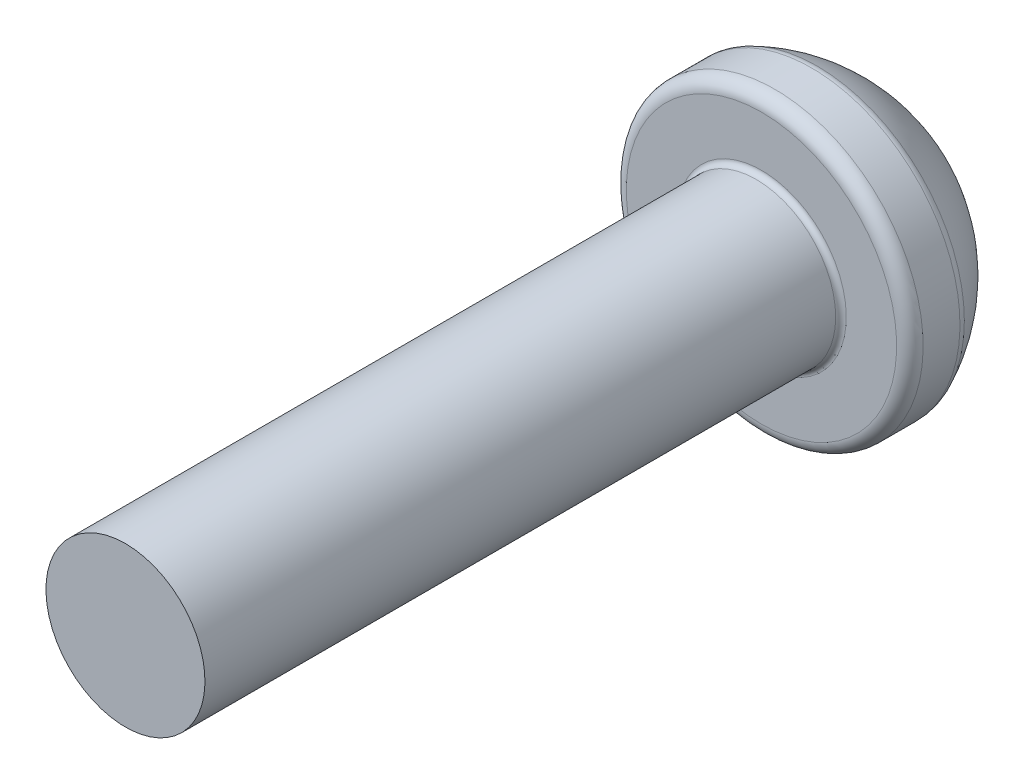
ISO-10303-21;
HEADER;
FILE_DESCRIPTION(('STEP AP214'),'2;1');
FILE_NAME('part.step','',(''),(''),'','','');
FILE_SCHEMA(('AUTOMOTIVE_DESIGN { 1 0 10303 214 1 1 1 1 }'));
ENDSEC;
DATA;
#1=APPLICATION_CONTEXT('core data for automotive mechanical design processes');
#2=APPLICATION_PROTOCOL_DEFINITION('international standard','automotive_design',2000,#1);
#3=PRODUCT_CONTEXT('',#1,'mechanical');
#4=PRODUCT('Part','Part','',(#3));
#5=PRODUCT_RELATED_PRODUCT_CATEGORY('part','',(#4));
#6=PRODUCT_DEFINITION_FORMATION('','',#4);
#7=PRODUCT_DEFINITION_CONTEXT('part definition',#1,'design');
#8=PRODUCT_DEFINITION('design','',#6,#7);
#9=PRODUCT_DEFINITION_SHAPE('','',#8);
#10=(LENGTH_UNIT() NAMED_UNIT(*) SI_UNIT(.MILLI.,.METRE.));
#11=(NAMED_UNIT(*) PLANE_ANGLE_UNIT() SI_UNIT($,.RADIAN.));
#12=(NAMED_UNIT(*) SI_UNIT($,.STERADIAN.) SOLID_ANGLE_UNIT());
#13=UNCERTAINTY_MEASURE_WITH_UNIT(LENGTH_MEASURE(1.E-05),#10,'distance_accuracy_value','');
#14=(GEOMETRIC_REPRESENTATION_CONTEXT(3) GLOBAL_UNCERTAINTY_ASSIGNED_CONTEXT((#13)) GLOBAL_UNIT_ASSIGNED_CONTEXT((#10,
#11,#12)) REPRESENTATION_CONTEXT('',''));
#15=CARTESIAN_POINT('',(0.,0.,0.));
#16=DIRECTION('',(0.,0.,1.));
#17=DIRECTION('',(1.,0.,0.));
#18=AXIS2_PLACEMENT_3D('',#15,#16,#17);
#19=CARTESIAN_POINT('',(0.,0.,12.));
#20=DIRECTION('',(0.,0.,1.));
#21=DIRECTION('',(0.,-1.,0.));
#22=AXIS2_PLACEMENT_3D('',#19,#20,#21);
#23=PLANE('',#22);
#24=CARTESIAN_POINT('',(0.,0.,12.));
#25=DIRECTION('',(0.,0.,-1.));
#26=DIRECTION('',(0.,1.,0.));
#27=AXIS2_PLACEMENT_3D('',#24,#25,#26);
#28=CIRCLE('',#27,1.5);
#29=CARTESIAN_POINT('',(0.,1.5,12.));
#30=VERTEX_POINT('',#29);
#31=EDGE_CURVE('E267',#30,#30,#28,.T.);
#32=ORIENTED_EDGE('',*,*,#31,.F.);
#33=EDGE_LOOP('',(#32));
#34=FACE_BOUND('',#33,.T.);
#35=ADVANCED_FACE('F36',(#34),#23,.T.);
#36=CARTESIAN_POINT('',(0.,0.,-2.4));
#37=DIRECTION('',(0.,0.,-1.));
#38=DIRECTION('',(0.,1.,0.));
#39=AXIS2_PLACEMENT_3D('',#36,#37,#38);
#40=CYLINDRICAL_SURFACE('',#39,1.5);
#41=CARTESIAN_POINT('',(0.,0.,0.0999999999999959));
#42=DIRECTION('',(0.,0.,1.));
#43=DIRECTION('',(0.,-1.,0.));
#44=AXIS2_PLACEMENT_3D('',#41,#42,#43);
#45=CIRCLE('',#44,1.5);
#46=CARTESIAN_POINT('',(0.,-1.5,0.0999999999999958));
#47=VERTEX_POINT('',#46);
#48=EDGE_CURVE('E273',#47,#47,#45,.T.);
#49=ORIENTED_EDGE('',*,*,#48,.T.);
#50=EDGE_LOOP('',(#49));
#51=FACE_BOUND('',#50,.T.);
#52=ORIENTED_EDGE('',*,*,#31,.T.);
#53=EDGE_LOOP('',(#52));
#54=FACE_BOUND('',#53,.T.);
#55=ADVANCED_FACE('F311',(#51,#54),#40,.T.);
#56=CARTESIAN_POINT('',(0.,1.5,0.));
#57=DIRECTION('',(0.,0.,1.));
#58=DIRECTION('',(0.,-1.,0.));
#59=AXIS2_PLACEMENT_3D('',#56,#57,#58);
#60=PLANE('',#59);
#61=CARTESIAN_POINT('',(0.,0.,0.));
#62=DIRECTION('',(0.,0.,1.));
#63=DIRECTION('',(0.,-1.,0.));
#64=AXIS2_PLACEMENT_3D('',#61,#62,#63);
#65=CIRCLE('',#64,2.55);
#66=CARTESIAN_POINT('',(0.,-2.55,0.));
#67=VERTEX_POINT('',#66);
#68=EDGE_CURVE('E11',#67,#67,#65,.T.);
#69=ORIENTED_EDGE('',*,*,#68,.T.);
#70=EDGE_LOOP('',(#69));
#71=FACE_BOUND('',#70,.T.);
#72=CARTESIAN_POINT('',(0.,0.,0.));
#73=DIRECTION('',(0.,0.,1.));
#74=DIRECTION('',(0.,-1.,0.));
#75=AXIS2_PLACEMENT_3D('',#72,#73,#74);
#76=CIRCLE('',#75,1.6);
#77=CARTESIAN_POINT('',(0.,-1.6,0.));
#78=VERTEX_POINT('',#77);
#79=EDGE_CURVE('E270',#78,#78,#76,.F.);
#80=ORIENTED_EDGE('',*,*,#79,.T.);
#81=EDGE_LOOP('',(#80));
#82=FACE_BOUND('',#81,.T.);
#83=ADVANCED_FACE('F317',(#71,#82),#60,.T.);
#84=CARTESIAN_POINT('',(0.,0.,-2.4));
#85=DIRECTION('',(0.,0.,-1.));
#86=DIRECTION('',(0.,1.,0.));
#87=AXIS2_PLACEMENT_3D('',#84,#85,#86);
#88=CYLINDRICAL_SURFACE('',#87,2.8);
#89=CARTESIAN_POINT('',(0.,0.,-0.945424841825034));
#90=DIRECTION('',(0.,0.,1.));
#91=DIRECTION('',(0.,-1.,0.));
#92=AXIS2_PLACEMENT_3D('',#89,#90,#91);
#93=CIRCLE('',#92,2.8);
#94=CARTESIAN_POINT('',(0.,-2.79999999999999,-0.945424841825034));
#95=VERTEX_POINT('',#94);
#96=EDGE_CURVE('E44',#95,#95,#93,.T.);
#97=ORIENTED_EDGE('',*,*,#96,.T.);
#98=EDGE_LOOP('',(#97));
#99=FACE_BOUND('',#98,.T.);
#100=CARTESIAN_POINT('',(0.,0.,-0.25));
#101=DIRECTION('',(0.,0.,1.));
#102=DIRECTION('',(0.,-1.,0.));
#103=AXIS2_PLACEMENT_3D('',#100,#101,#102);
#104=CIRCLE('',#103,2.8);
#105=CARTESIAN_POINT('',(0.,-2.79999999999999,-0.25));
#106=VERTEX_POINT('',#105);
#107=EDGE_CURVE('E279',#106,#106,#104,.F.);
#108=ORIENTED_EDGE('',*,*,#107,.T.);
#109=EDGE_LOOP('',(#108));
#110=FACE_BOUND('',#109,.T.);
#111=ADVANCED_FACE('F284',(#99,#110),#88,.T.);
#112=CARTESIAN_POINT('',(0.,0.,0.252999999999989));
#113=DIRECTION('',(0.,0.,-1.));
#114=DIRECTION('',(0.,1.,0.));
#115=AXIS2_PLACEMENT_3D('',#112,#113,#114);
#116=SPHERICAL_SURFACE('',#115,3.06757379699332);
#117=CARTESIAN_POINT('',(0.,0.,-1.05175966463463));
#118=DIRECTION('',(0.,0.,1.));
#119=DIRECTION('',(0.,-1.,0.));
#120=AXIS2_PLACEMENT_3D('',#117,#118,#119);
#121=CIRCLE('',#120,2.77625849256558);
#122=CARTESIAN_POINT('',(0.,2.7762584925656,-1.05175966463463));
#123=VERTEX_POINT('',#122);
#124=EDGE_CURVE('E276',#123,#123,#121,.F.);
#125=CARTESIAN_POINT('',(0.,0.,-2.4));
#126=DIRECTION('',(0.,0.,-1.));
#127=DIRECTION('',(0.,1.,0.));
#128=AXIS2_PLACEMENT_3D('',#125,#126,#127);
#129=CIRCLE('',#128,1.54);
#130=CARTESIAN_POINT('',(0.,1.54000000000003,-2.4));
#131=VERTEX_POINT('',#130);
#132=EDGE_CURVE('E263',#131,#131,#129,.T.);
#133=CARTESIAN_POINT('',(0.,2.7762584925656,-1.05175966463463));
#134=CARTESIAN_POINT('',(0.,2.7680287356093,-1.06927093928298));
#135=CARTESIAN_POINT('',(0.,2.75963325856512,-1.08670432952202));
#136=CARTESIAN_POINT('',(0.,2.74251396302796,-1.12140914487731));
#137=CARTESIAN_POINT('',(0.,2.73379014453498,-1.13868056999356));
#138=CARTESIAN_POINT('',(0.,2.71601726482719,-1.17305525879907));
#139=CARTESIAN_POINT('',(0.,2.70696820361239,-1.19015852248834));
#140=CARTESIAN_POINT('',(0.,2.68854808514227,-1.22419076788491));
#141=CARTESIAN_POINT('',(0.,2.67917702788696,-1.24111974959221));
#142=CARTESIAN_POINT('',(0.,2.66011627086749,-1.27479736870806));
#143=CARTESIAN_POINT('',(0.,2.65042657110332,-1.2915460061166));
#144=CARTESIAN_POINT('',(0.,2.63073199894966,-1.32485694000622));
#145=CARTESIAN_POINT('',(0.,2.62072712656017,-1.34141923648728));
#146=CARTESIAN_POINT('',(0.,2.60040579128123,-1.37435155831383));
#147=CARTESIAN_POINT('',(0.,2.59008932839179,-1.3907215836593));
#148=CARTESIAN_POINT('',(0.,2.56914850596595,-1.4232635019295));
#149=CARTESIAN_POINT('',(0.,2.55852414642956,-1.43943539485421));
#150=CARTESIAN_POINT('',(0.,2.53697133476198,-1.47157525791774));
#151=CARTESIAN_POINT('',(0.,2.5260428826308,-1.48754322805656));
#152=CARTESIAN_POINT('',(0.,2.50388579871809,-1.51926952820363));
#153=CARTESIAN_POINT('',(0.,2.49265716693656,-1.53502785821189));
#154=CARTESIAN_POINT('',(0.,2.46990374414406,-1.56632923581349));
#155=CARTESIAN_POINT('',(0.,2.45837895313309,-1.58187228340683));
#156=CARTESIAN_POINT('',(0.,2.43503733834353,-1.6127375309767));
#157=CARTESIAN_POINT('',(0.,2.42322051456494,-1.62805973095323));
#158=CARTESIAN_POINT('',(0.,2.39929906526433,-1.65847779716217));
#159=CARTESIAN_POINT('',(0.,2.38719443974231,-1.67357366339458));
#160=CARTESIAN_POINT('',(0.,2.36270172102676,-1.70353365702699));
#161=CARTESIAN_POINT('',(0.,2.35031362783323,-1.71839778442699));
#162=CARTESIAN_POINT('',(0.,2.32525840934239,-1.74788897828058));
#163=CARTESIAN_POINT('',(0.,2.3125912840451,-1.76251604473417));
#164=CARTESIAN_POINT('',(0.,2.28698253682219,-1.79152787946082));
#165=CARTESIAN_POINT('',(0.,2.27404091489658,-1.80591264773389));
#166=CARTESIAN_POINT('',(0.,2.24788780817625,-1.83443473562044));
#167=CARTESIAN_POINT('',(0.,2.23467632338154,-1.84857205523394));
#168=CARTESIAN_POINT('',(0.,2.20798822130685,-1.87659418392154));
#169=CARTESIAN_POINT('',(0.,2.19451160402688,-1.89047899299564));
#170=CARTESIAN_POINT('',(0.,2.16729806229645,-1.91799112913625));
#171=CARTESIAN_POINT('',(0.,2.15356113784599,-1.93161845620276));
#172=CARTESIAN_POINT('',(0.,2.12583190029257,-1.95861074905163));
#173=CARTESIAN_POINT('',(0.,2.11183958718961,-1.971975714834));
#174=CARTESIAN_POINT('',(0.,2.0836045822913,-1.99843849977674));
#175=CARTESIAN_POINT('',(0.,2.06936189049595,-2.0115363189371));
#176=CARTESIAN_POINT('',(0.,2.04063122782131,-2.03746012095011));
#177=CARTESIAN_POINT('',(0.,2.02614325694202,-2.05028610380276));
#178=CARTESIAN_POINT('',(0.,1.99692722353024,-2.07566164084561));
#179=CARTESIAN_POINT('',(0.,1.98219916099774,-2.08821119503583));
#180=CARTESIAN_POINT('',(0.,1.95250821767576,-2.11302938137545));
#181=CARTESIAN_POINT('',(0.,1.93754533688628,-2.12529801352486));
#182=CARTESIAN_POINT('',(0.,1.90739011452165,-2.14954996298589));
#183=CARTESIAN_POINT('',(0.,1.89219777294651,-2.16153328029752));
#184=CARTESIAN_POINT('',(0.,1.86158906864724,-2.18521030945437));
#185=CARTESIAN_POINT('',(0.,1.84617270592312,-2.19690402129959));
#186=CARTESIAN_POINT('',(0.,1.81512147914842,-2.21999765254702));
#187=CARTESIAN_POINT('',(0.,1.79948661509784,-2.23139757194921));
#188=CARTESIAN_POINT('',(0.,1.76800398382117,-2.25389953668146));
#189=CARTESIAN_POINT('',(0.,1.75215621659508,-2.2650015820115));
#190=CARTESIAN_POINT('',(0.,1.72025345299829,-2.28690382304649));
#191=CARTESIAN_POINT('',(0.,1.70419845662759,-2.29770401875144));
#192=CARTESIAN_POINT('',(0.,1.67188698427812,-2.31899869521752));
#193=CARTESIAN_POINT('',(0.,1.65563050829935,-2.32949317597865));
#194=CARTESIAN_POINT('',(0.,1.62292189353217,-2.35017265865099));
#195=CARTESIAN_POINT('',(0.,1.60646975474376,-2.36035766056221));
#196=CARTESIAN_POINT('',(0.,1.57337571941822,-2.38041456247663));
#197=CARTESIAN_POINT('',(0.,1.55673382288108,-2.39028646247984));
#198=CARTESIAN_POINT('',(0.,1.54000000000003,-2.4));
#199=B_SPLINE_CURVE_WITH_KNOTS('',3,(#133,#134,#135,#136,#137,#138,#139,#140,#141,#142,#143,
#144,#145,#146,#147,#148,#149,#150,#151,#152,#153,#154,#155,#156,#157,#158,#159,#160,#161,#162,
#163,#164,#165,#166,#167,#168,#169,#170,#171,#172,#173,#174,#175,#176,#177,#178,#179,#180,#181,
#182,#183,#184,#185,#186,#187,#188,#189,#190,#191,#192,#193,#194,#195,#196,#197,#198),
.UNSPECIFIED.,.F.,.F.,(4,2,2,2,2,2,2,2,2,2,2,2,2,2,2,2,2,2,2,2,2,2,2,2,2,2,2,2,2,2,2,2,4),(0.,
0.058045344934751,0.116090689869502,0.174136034804254,0.232181379739005,0.290226724673756,
0.348272069608506,0.406317414543258,0.464362759478009,0.52240810441276,0.580453449347511,
0.638498794282262,0.696544139217013,0.754589484151765,0.812634829086516,0.870680174021267,
0.928725518956018,0.986770863890769,1.04481620882552,1.10286155376027,1.16090689869502,
1.21895224362977,1.27699758856452,1.33504293349928,1.39308827843403,1.45113362336878,
1.50917896830353,1.56722431323828,1.62526965817303,1.68331500310778,1.74136034804253,
1.79940569297728,1.85745103791204),.UNSPECIFIED.);
#200=EDGE_CURVE('BSEAM293',#123,#131,#199,.T.);
#201=ORIENTED_EDGE('',*,*,#124,.T.);
#202=ORIENTED_EDGE('',*,*,#132,.F.);
#203=ORIENTED_EDGE('',*,*,#200,.T.);
#204=ORIENTED_EDGE('',*,*,#200,.F.);
#205=EDGE_LOOP('',(#201,#203,#202,#204));
#206=FACE_BOUND('',#205,.T.);
#207=ADVANCED_FACE('F293',(#206),#116,.T.);
#208=CARTESIAN_POINT('',(0.,0.,-2.4));
#209=DIRECTION('',(0.,0.,-1.));
#210=DIRECTION('',(0.,1.,0.));
#211=AXIS2_PLACEMENT_3D('',#208,#209,#210);
#212=PLANE('',#211);
#213=CARTESIAN_POINT('',(0.,0.,-2.4));
#214=DIRECTION('',(0.,0.,-1.));
#215=DIRECTION('',(0.,1.,0.));
#216=AXIS2_PLACEMENT_3D('',#213,#214,#215);
#217=CIRCLE('',#216,1.4);
#218=CARTESIAN_POINT('',(0.217707917147369,-1.38296900283821,-2.40000000000001));
#219=VERTEX_POINT('',#218);
#220=CARTESIAN_POINT('',(-0.217707917147369,-1.38296900283821,-2.4));
#221=VERTEX_POINT('',#220);
#222=EDGE_CURVE('E222',#219,#221,#217,.T.);
#223=ORIENTED_EDGE('',*,*,#222,.F.);
#224=CARTESIAN_POINT('',(0.807499999999989,-1.39863102711185,-2.4));
#225=DIRECTION('',(0.,0.,1.));
#226=DIRECTION('',(0.,1.,0.));
#227=AXIS2_PLACEMENT_3D('',#224,#225,#226);
#228=CIRCLE('',#227,0.59);
#229=CARTESIAN_POINT('',(1.08883233053066,-0.880025088273714,-2.4));
#230=VERTEX_POINT('',#229);
#231=EDGE_CURVE('E220',#230,#219,#228,.T.);
#232=ORIENTED_EDGE('',*,*,#231,.F.);
#233=CARTESIAN_POINT('',(0.,0.,-2.4));
#234=DIRECTION('',(0.,0.,-1.));
#235=DIRECTION('',(0.,1.,0.));
#236=AXIS2_PLACEMENT_3D('',#233,#234,#235);
#237=CIRCLE('',#236,1.4);
#238=CARTESIAN_POINT('',(1.30654024767801,-0.502943914564485,-2.40000000000001));
#239=VERTEX_POINT('',#238);
#240=EDGE_CURVE('E217',#239,#230,#237,.T.);
#241=ORIENTED_EDGE('',*,*,#240,.F.);
#242=CARTESIAN_POINT('',(1.61500000000001,0.,-2.4));
#243=DIRECTION('',(0.,0.,1.));
#244=DIRECTION('',(0.,1.,0.));
#245=AXIS2_PLACEMENT_3D('',#242,#243,#244);
#246=CIRCLE('',#245,0.59);
#247=CARTESIAN_POINT('',(1.306540247678,0.502943914564513,-2.40000000000001));
#248=VERTEX_POINT('',#247);
#249=EDGE_CURVE('E215',#248,#239,#246,.T.);
#250=ORIENTED_EDGE('',*,*,#249,.F.);
#251=CARTESIAN_POINT('',(0.,0.,-2.4));
#252=DIRECTION('',(0.,0.,-1.));
#253=DIRECTION('',(0.,1.,0.));
#254=AXIS2_PLACEMENT_3D('',#251,#252,#253);
#255=CIRCLE('',#254,1.4);
#256=CARTESIAN_POINT('',(1.08883233053066,0.880025088273756,-2.4));
#257=VERTEX_POINT('',#256);
#258=EDGE_CURVE('E212',#257,#248,#255,.T.);
#259=ORIENTED_EDGE('',*,*,#258,.F.);
#260=CARTESIAN_POINT('',(0.807500000000003,1.39863102711189,-2.40000000000001));
#261=DIRECTION('',(0.,0.,1.));
#262=DIRECTION('',(0.,1.,0.));
#263=AXIS2_PLACEMENT_3D('',#260,#261,#262);
#264=CIRCLE('',#263,0.59);
#265=CARTESIAN_POINT('',(0.217707917147369,1.38296900283824,-2.40000000000001));
#266=VERTEX_POINT('',#265);
#267=EDGE_CURVE('E210',#266,#257,#264,.T.);
#268=ORIENTED_EDGE('',*,*,#267,.F.);
#269=CARTESIAN_POINT('',(0.,0.,-2.4));
#270=DIRECTION('',(0.,0.,-1.));
#271=DIRECTION('',(0.,1.,0.));
#272=AXIS2_PLACEMENT_3D('',#269,#270,#271);
#273=CIRCLE('',#272,1.4);
#274=CARTESIAN_POINT('',(-0.217707917147369,1.38296900283824,-2.40000000000001));
#275=VERTEX_POINT('',#274);
#276=EDGE_CURVE('E207',#275,#266,#273,.T.);
#277=ORIENTED_EDGE('',*,*,#276,.F.);
#278=CARTESIAN_POINT('',(-0.807500000000017,1.39863102711187,-2.4));
#279=DIRECTION('',(0.,0.,1.));
#280=DIRECTION('',(0.,1.,0.));
#281=AXIS2_PLACEMENT_3D('',#278,#279,#280);
#282=CIRCLE('',#281,0.59);
#283=CARTESIAN_POINT('',(-1.08883233053068,0.880025088273728,-2.4));
#284=VERTEX_POINT('',#283);
#285=EDGE_CURVE('E205',#284,#275,#282,.T.);
#286=ORIENTED_EDGE('',*,*,#285,.F.);
#287=CARTESIAN_POINT('',(0.,0.,-2.4));
#288=DIRECTION('',(0.,0.,-1.));
#289=DIRECTION('',(0.,1.,0.));
#290=AXIS2_PLACEMENT_3D('',#287,#288,#289);
#291=CIRCLE('',#290,1.4);
#292=CARTESIAN_POINT('',(-1.30654024767801,0.502943914564513,-2.4));
#293=VERTEX_POINT('',#292);
#294=EDGE_CURVE('E203',#293,#284,#291,.T.);
#295=ORIENTED_EDGE('',*,*,#294,.F.);
#296=CARTESIAN_POINT('',(-1.61500000000001,0.,-2.4));
#297=DIRECTION('',(0.,0.,1.));
#298=DIRECTION('',(0.,1.,0.));
#299=AXIS2_PLACEMENT_3D('',#296,#297,#298);
#300=CIRCLE('',#299,0.59);
#301=CARTESIAN_POINT('',(-1.30654024767803,-0.502943914564485,-2.4));
#302=VERTEX_POINT('',#301);
#303=EDGE_CURVE('E163',#302,#293,#300,.T.);
#304=ORIENTED_EDGE('',*,*,#303,.F.);
#305=CARTESIAN_POINT('',(0.,0.,-2.4));
#306=DIRECTION('',(0.,0.,-1.));
#307=DIRECTION('',(0.,1.,0.));
#308=AXIS2_PLACEMENT_3D('',#305,#306,#307);
#309=CIRCLE('',#308,1.4);
#310=CARTESIAN_POINT('',(-1.08883233053063,-0.880025088273714,-2.4));
#311=VERTEX_POINT('',#310);
#312=EDGE_CURVE('E159',#311,#302,#309,.T.);
#313=ORIENTED_EDGE('',*,*,#312,.F.);
#314=CARTESIAN_POINT('',(-0.807500000000003,-1.39863102711185,-2.4));
#315=DIRECTION('',(0.,0.,1.));
#316=DIRECTION('',(0.,1.,0.));
#317=AXIS2_PLACEMENT_3D('',#314,#315,#316);
#318=CIRCLE('',#317,0.59);
#319=EDGE_CURVE('E225',#221,#311,#318,.T.);
#320=ORIENTED_EDGE('',*,*,#319,.F.);
#321=EDGE_LOOP('',(#223,#232,#241,#250,#259,#268,#277,#286,#295,#304,#313,#320));
#322=FACE_BOUND('',#321,.T.);
#323=ORIENTED_EDGE('',*,*,#132,.T.);
#324=EDGE_LOOP('',(#323));
#325=FACE_BOUND('',#324,.T.);
#326=ADVANCED_FACE('F296',(#322,#325),#212,.T.);
#327=CARTESIAN_POINT('',(0.,0.,0.0999999999999959));
#328=DIRECTION('',(0.,0.,1.));
#329=DIRECTION('',(0.,-1.,0.));
#330=AXIS2_PLACEMENT_3D('',#327,#328,#329);
#331=TOROIDAL_SURFACE('',#330,1.6,0.1);
#332=ORIENTED_EDGE('',*,*,#48,.F.);
#333=EDGE_LOOP('',(#332));
#334=FACE_BOUND('',#333,.T.);
#335=ORIENTED_EDGE('',*,*,#79,.F.);
#336=EDGE_LOOP('',(#335));
#337=FACE_BOUND('',#336,.T.);
#338=ADVANCED_FACE('F290',(#334,#337),#331,.F.);
#339=CARTESIAN_POINT('',(0.,0.,-0.945424841825034));
#340=DIRECTION('',(0.,0.,1.));
#341=DIRECTION('',(0.,-1.,0.));
#342=AXIS2_PLACEMENT_3D('',#339,#340,#341);
#343=TOROIDAL_SURFACE('',#342,2.55,0.25);
#344=ORIENTED_EDGE('',*,*,#96,.F.);
#345=EDGE_LOOP('',(#344));
#346=FACE_BOUND('',#345,.T.);
#347=ORIENTED_EDGE('',*,*,#124,.F.);
#348=EDGE_LOOP('',(#347));
#349=FACE_BOUND('',#348,.T.);
#350=ADVANCED_FACE('F287',(#346,#349),#343,.T.);
#351=CARTESIAN_POINT('',(0.,0.,-0.25));
#352=DIRECTION('',(0.,0.,1.));
#353=DIRECTION('',(0.,-1.,0.));
#354=AXIS2_PLACEMENT_3D('',#351,#352,#353);
#355=TOROIDAL_SURFACE('',#354,2.55,0.25);
#356=ORIENTED_EDGE('',*,*,#68,.F.);
#357=EDGE_LOOP('',(#356));
#358=FACE_BOUND('',#357,.T.);
#359=ORIENTED_EDGE('',*,*,#107,.F.);
#360=EDGE_LOOP('',(#359));
#361=FACE_BOUND('',#360,.T.);
#362=ADVANCED_FACE('F38',(#358,#361),#355,.T.);
#363=CARTESIAN_POINT('',(-1.61499999999999,0.,-1.4));
#364=DIRECTION('',(0.,0.,-1.));
#365=DIRECTION('',(0.,1.,0.));
#366=AXIS2_PLACEMENT_3D('',#363,#364,#365);
#367=CYLINDRICAL_SURFACE('',#366,0.59);
#368=CARTESIAN_POINT('',(-1.61499999999999,0.,-1.4));
#369=DIRECTION('',(0.,0.,1.));
#370=DIRECTION('',(0.,1.,0.));
#371=AXIS2_PLACEMENT_3D('',#368,#369,#370);
#372=CIRCLE('',#371,0.59);
#373=CARTESIAN_POINT('',(-1.306540247678,-0.502943914564485,-1.40000000000001));
#374=VERTEX_POINT('',#373);
#375=CARTESIAN_POINT('',(-1.025,0.,-1.40000000000001));
#376=VERTEX_POINT('',#375);
#377=EDGE_CURVE('E158',#374,#376,#372,.T.);
#378=ORIENTED_EDGE('',*,*,#377,.F.);
#379=DIRECTION('',(0.,0.,-1.));
#380=VECTOR('',#379,1.);
#381=CARTESIAN_POINT('',(-1.306540247678,-0.502943914564485,-1.40000000000001));
#382=LINE('',#381,#380);
#383=EDGE_CURVE('E229',#374,#302,#382,.T.);
#384=ORIENTED_EDGE('',*,*,#383,.T.);
#385=ORIENTED_EDGE('',*,*,#303,.T.);
#386=DIRECTION('',(0.,0.,-1.));
#387=VECTOR('',#386,1.);
#388=CARTESIAN_POINT('',(-1.30654024767804,0.502943914564513,-1.40000000000001));
#389=LINE('',#388,#387);
#390=CARTESIAN_POINT('',(-1.30654024767804,0.502943914564513,-1.40000000000001));
#391=VERTEX_POINT('',#390);
#392=EDGE_CURVE('E51',#391,#293,#389,.T.);
#393=ORIENTED_EDGE('',*,*,#392,.F.);
#394=EDGE_CURVE('E149',#376,#391,#372,.T.);
#395=ORIENTED_EDGE('',*,*,#394,.F.);
#396=EDGE_LOOP('',(#378,#384,#385,#393,#395));
#397=FACE_BOUND('',#396,.T.);
#398=ADVANCED_FACE('F161',(#397),#367,.T.);
#399=CARTESIAN_POINT('',(-0.807500000000003,-1.39863102711185,-1.40000000000001));
#400=DIRECTION('',(0.,0.,-1.));
#401=DIRECTION('',(0.,1.,0.));
#402=AXIS2_PLACEMENT_3D('',#399,#400,#401);
#403=CYLINDRICAL_SURFACE('',#402,0.59);
#404=CARTESIAN_POINT('',(-0.807500000000003,-1.39863102711185,-1.40000000000001));
#405=DIRECTION('',(0.,0.,1.));
#406=DIRECTION('',(0.,1.,0.));
#407=AXIS2_PLACEMENT_3D('',#404,#405,#406);
#408=CIRCLE('',#407,0.59);
#409=CARTESIAN_POINT('',(-0.217707917147369,-1.38296900283821,-1.40000000000001));
#410=VERTEX_POINT('',#409);
#411=CARTESIAN_POINT('',(-0.512499999999999,-0.887676038879043,-1.40000000000001));
#412=VERTEX_POINT('',#411);
#413=EDGE_CURVE('E197',#410,#412,#408,.T.);
#414=ORIENTED_EDGE('',*,*,#413,.F.);
#415=DIRECTION('',(0.,0.,-1.));
#416=VECTOR('',#415,1.);
#417=CARTESIAN_POINT('',(-0.217707917147369,-1.38296900283821,-1.40000000000001));
#418=LINE('',#417,#416);
#419=EDGE_CURVE('E235',#410,#221,#418,.T.);
#420=ORIENTED_EDGE('',*,*,#419,.T.);
#421=ORIENTED_EDGE('',*,*,#319,.T.);
#422=DIRECTION('',(0.,0.,-1.));
#423=VECTOR('',#422,1.);
#424=CARTESIAN_POINT('',(-1.08883233053066,-0.880025088273714,-1.40000000000001));
#425=LINE('',#424,#423);
#426=CARTESIAN_POINT('',(-1.08883233053066,-0.880025088273714,-1.40000000000001));
#427=VERTEX_POINT('',#426);
#428=EDGE_CURVE('E232',#427,#311,#425,.T.);
#429=ORIENTED_EDGE('',*,*,#428,.F.);
#430=EDGE_CURVE('E196',#412,#427,#408,.T.);
#431=ORIENTED_EDGE('',*,*,#430,.F.);
#432=EDGE_LOOP('',(#414,#420,#421,#429,#431));
#433=FACE_BOUND('',#432,.T.);
#434=ADVANCED_FACE('F368',(#433),#403,.T.);
#435=CARTESIAN_POINT('',(0.807500000000003,-1.39863102711187,-1.40000000000001));
#436=DIRECTION('',(0.,0.,-1.));
#437=DIRECTION('',(0.,1.,0.));
#438=AXIS2_PLACEMENT_3D('',#435,#436,#437);
#439=CYLINDRICAL_SURFACE('',#438,0.59);
#440=CARTESIAN_POINT('',(0.807500000000003,-1.39863102711187,-1.40000000000001));
#441=DIRECTION('',(0.,0.,1.));
#442=DIRECTION('',(0.,1.,0.));
#443=AXIS2_PLACEMENT_3D('',#440,#441,#442);
#444=CIRCLE('',#443,0.59);
#445=CARTESIAN_POINT('',(1.08883233053066,-0.880025088273714,-1.40000000000001));
#446=VERTEX_POINT('',#445);
#447=CARTESIAN_POINT('',(0.512500000000013,-0.887676038879043,-1.40000000000001));
#448=VERTEX_POINT('',#447);
#449=EDGE_CURVE('E190',#446,#448,#444,.T.);
#450=ORIENTED_EDGE('',*,*,#449,.F.);
#451=DIRECTION('',(0.,0.,-1.));
#452=VECTOR('',#451,1.);
#453=CARTESIAN_POINT('',(1.08883233053066,-0.880025088273714,-1.40000000000001));
#454=LINE('',#453,#452);
#455=EDGE_CURVE('E241',#446,#230,#454,.T.);
#456=ORIENTED_EDGE('',*,*,#455,.T.);
#457=ORIENTED_EDGE('',*,*,#231,.T.);
#458=DIRECTION('',(0.,0.,-1.));
#459=VECTOR('',#458,1.);
#460=CARTESIAN_POINT('',(0.217707917147383,-1.38296900283821,-1.40000000000001));
#461=LINE('',#460,#459);
#462=CARTESIAN_POINT('',(0.217707917147383,-1.38296900283821,-1.40000000000001));
#463=VERTEX_POINT('',#462);
#464=EDGE_CURVE('E238',#463,#219,#461,.T.);
#465=ORIENTED_EDGE('',*,*,#464,.F.);
#466=EDGE_CURVE('E189',#448,#463,#444,.T.);
#467=ORIENTED_EDGE('',*,*,#466,.F.);
#468=EDGE_LOOP('',(#450,#456,#457,#465,#467));
#469=FACE_BOUND('',#468,.T.);
#470=ADVANCED_FACE('F377',(#469),#439,.T.);
#471=CARTESIAN_POINT('',(1.61500000000001,0.,-1.40000000000001));
#472=DIRECTION('',(0.,0.,-1.));
#473=DIRECTION('',(0.,1.,0.));
#474=AXIS2_PLACEMENT_3D('',#471,#472,#473);
#475=CYLINDRICAL_SURFACE('',#474,0.59);
#476=CARTESIAN_POINT('',(1.61500000000001,0.,-1.40000000000001));
#477=DIRECTION('',(0.,0.,1.));
#478=DIRECTION('',(0.,1.,0.));
#479=AXIS2_PLACEMENT_3D('',#476,#477,#478);
#480=CIRCLE('',#479,0.59);
#481=CARTESIAN_POINT('',(1.30654024767803,0.502943914564513,-1.40000000000001));
#482=VERTEX_POINT('',#481);
#483=CARTESIAN_POINT('',(1.02499999999998,0.,-1.40000000000001));
#484=VERTEX_POINT('',#483);
#485=EDGE_CURVE('E183',#482,#484,#480,.T.);
#486=ORIENTED_EDGE('',*,*,#485,.F.);
#487=DIRECTION('',(0.,0.,-1.));
#488=VECTOR('',#487,1.);
#489=CARTESIAN_POINT('',(1.30654024767803,0.502943914564513,-1.40000000000001));
#490=LINE('',#489,#488);
#491=EDGE_CURVE('E247',#482,#248,#490,.T.);
#492=ORIENTED_EDGE('',*,*,#491,.T.);
#493=ORIENTED_EDGE('',*,*,#249,.T.);
#494=DIRECTION('',(0.,0.,-1.));
#495=VECTOR('',#494,1.);
#496=CARTESIAN_POINT('',(1.30654024767801,-0.502943914564485,-1.40000000000001));
#497=LINE('',#496,#495);
#498=CARTESIAN_POINT('',(1.30654024767801,-0.502943914564485,-1.40000000000001));
#499=VERTEX_POINT('',#498);
#500=EDGE_CURVE('E244',#499,#239,#497,.T.);
#501=ORIENTED_EDGE('',*,*,#500,.F.);
#502=EDGE_CURVE('E182',#484,#499,#480,.T.);
#503=ORIENTED_EDGE('',*,*,#502,.F.);
#504=EDGE_LOOP('',(#486,#492,#493,#501,#503));
#505=FACE_BOUND('',#504,.T.);
#506=ADVANCED_FACE('F387',(#505),#475,.T.);
#507=CARTESIAN_POINT('',(0.807499999999975,1.39863102711188,-1.40000000000001));
#508=DIRECTION('',(0.,0.,-1.));
#509=DIRECTION('',(0.,1.,0.));
#510=AXIS2_PLACEMENT_3D('',#507,#508,#509);
#511=CYLINDRICAL_SURFACE('',#510,0.59);
#512=CARTESIAN_POINT('',(0.807499999999975,1.39863102711188,-1.40000000000001));
#513=DIRECTION('',(0.,0.,1.));
#514=DIRECTION('',(0.,1.,0.));
#515=AXIS2_PLACEMENT_3D('',#512,#513,#514);
#516=CIRCLE('',#515,0.59);
#517=CARTESIAN_POINT('',(0.217707917147342,1.38296900283824,-1.40000000000001));
#518=VERTEX_POINT('',#517);
#519=CARTESIAN_POINT('',(0.512499999999999,0.887676038879071,-1.40000000000001));
#520=VERTEX_POINT('',#519);
#521=EDGE_CURVE('E59',#518,#520,#516,.T.);
#522=ORIENTED_EDGE('',*,*,#521,.F.);
#523=DIRECTION('',(0.,0.,-1.));
#524=VECTOR('',#523,1.);
#525=CARTESIAN_POINT('',(0.217707917147342,1.38296900283824,-1.40000000000001));
#526=LINE('',#525,#524);
#527=EDGE_CURVE('E253',#518,#266,#526,.T.);
#528=ORIENTED_EDGE('',*,*,#527,.T.);
#529=ORIENTED_EDGE('',*,*,#267,.T.);
#530=DIRECTION('',(0.,0.,-1.));
#531=VECTOR('',#530,1.);
#532=CARTESIAN_POINT('',(1.08883233053063,0.880025088273742,-1.40000000000001));
#533=LINE('',#532,#531);
#534=CARTESIAN_POINT('',(1.08883233053063,0.880025088273742,-1.40000000000001));
#535=VERTEX_POINT('',#534);
#536=EDGE_CURVE('E250',#535,#257,#533,.T.);
#537=ORIENTED_EDGE('',*,*,#536,.F.);
#538=EDGE_CURVE('E177',#520,#535,#516,.T.);
#539=ORIENTED_EDGE('',*,*,#538,.F.);
#540=EDGE_LOOP('',(#522,#528,#529,#537,#539));
#541=FACE_BOUND('',#540,.T.);
#542=ADVANCED_FACE('F397',(#541),#511,.T.);
#543=CARTESIAN_POINT('',(-0.807499999999989,1.39863102711188,-1.40000000000001));
#544=DIRECTION('',(0.,0.,-1.));
#545=DIRECTION('',(0.,1.,0.));
#546=AXIS2_PLACEMENT_3D('',#543,#544,#545);
#547=CYLINDRICAL_SURFACE('',#546,0.59);
#548=CARTESIAN_POINT('',(-0.807499999999989,1.39863102711188,-1.40000000000001));
#549=DIRECTION('',(0.,0.,1.));
#550=DIRECTION('',(0.,1.,0.));
#551=AXIS2_PLACEMENT_3D('',#548,#549,#550);
#552=CIRCLE('',#551,0.59);
#553=CARTESIAN_POINT('',(-1.08883233053066,0.880025088273728,-1.40000000000001));
#554=VERTEX_POINT('',#553);
#555=CARTESIAN_POINT('',(-0.512499999999999,0.887676038879071,-1.40000000000001));
#556=VERTEX_POINT('',#555);
#557=EDGE_CURVE('E172',#554,#556,#552,.T.);
#558=ORIENTED_EDGE('',*,*,#557,.F.);
#559=DIRECTION('',(0.,0.,-1.));
#560=VECTOR('',#559,1.);
#561=CARTESIAN_POINT('',(-1.08883233053066,0.880025088273728,-1.40000000000001));
#562=LINE('',#561,#560);
#563=EDGE_CURVE('E165',#554,#284,#562,.T.);
#564=ORIENTED_EDGE('',*,*,#563,.T.);
#565=ORIENTED_EDGE('',*,*,#285,.T.);
#566=DIRECTION('',(0.,0.,-1.));
#567=VECTOR('',#566,1.);
#568=CARTESIAN_POINT('',(-0.217707917147369,1.38296900283824,-1.40000000000001));
#569=LINE('',#568,#567);
#570=CARTESIAN_POINT('',(-0.217707917147369,1.38296900283824,-1.40000000000001));
#571=VERTEX_POINT('',#570);
#572=EDGE_CURVE('E256',#571,#275,#569,.T.);
#573=ORIENTED_EDGE('',*,*,#572,.F.);
#574=EDGE_CURVE('E170',#556,#571,#552,.T.);
#575=ORIENTED_EDGE('',*,*,#574,.F.);
#576=EDGE_LOOP('',(#558,#564,#565,#573,#575));
#577=FACE_BOUND('',#576,.T.);
#578=ADVANCED_FACE('F407',(#577),#547,.T.);
#579=CARTESIAN_POINT('',(-0.807500000000017,0.,-1.40000000000001));
#580=DIRECTION('',(0.,0.,-1.));
#581=DIRECTION('',(0.,1.,0.));
#582=AXIS2_PLACEMENT_3D('',#579,#580,#581);
#583=PLANE('',#582);
#584=CARTESIAN_POINT('',(0.,0.,-1.40000000000001));
#585=DIRECTION('',(0.,0.,-1.));
#586=DIRECTION('',(0.,1.,0.));
#587=AXIS2_PLACEMENT_3D('',#584,#585,#586);
#588=CIRCLE('',#587,1.025);
#589=EDGE_CURVE('E154',#376,#556,#588,.T.);
#590=ORIENTED_EDGE('',*,*,#589,.F.);
#591=ORIENTED_EDGE('',*,*,#394,.T.);
#592=CARTESIAN_POINT('',(0.,0.,-1.40000000000001));
#593=DIRECTION('',(0.,0.,-1.));
#594=DIRECTION('',(0.,1.,0.));
#595=AXIS2_PLACEMENT_3D('',#592,#593,#594);
#596=CIRCLE('',#595,1.4);
#597=EDGE_CURVE('E152',#391,#554,#596,.T.);
#598=ORIENTED_EDGE('',*,*,#597,.T.);
#599=ORIENTED_EDGE('',*,*,#557,.T.);
#600=EDGE_LOOP('',(#590,#591,#598,#599));
#601=FACE_BOUND('',#600,.T.);
#602=ADVANCED_FACE('F150',(#601),#583,.T.);
#603=EDGE_CURVE('E552',#412,#376,#588,.T.);
#604=ORIENTED_EDGE('',*,*,#603,.F.);
#605=ORIENTED_EDGE('',*,*,#430,.T.);
#606=CARTESIAN_POINT('',(0.,0.,-1.40000000000001));
#607=DIRECTION('',(0.,0.,-1.));
#608=DIRECTION('',(0.,1.,0.));
#609=AXIS2_PLACEMENT_3D('',#606,#607,#608);
#610=CIRCLE('',#609,1.4);
#611=EDGE_CURVE('E166',#427,#374,#610,.T.);
#612=ORIENTED_EDGE('',*,*,#611,.T.);
#613=ORIENTED_EDGE('',*,*,#377,.T.);
#614=EDGE_LOOP('',(#604,#605,#612,#613));
#615=FACE_BOUND('',#614,.T.);
#616=ADVANCED_FACE('F426',(#615),#583,.T.);
#617=EDGE_CURVE('E551',#448,#412,#588,.T.);
#618=ORIENTED_EDGE('',*,*,#617,.F.);
#619=ORIENTED_EDGE('',*,*,#466,.T.);
#620=CARTESIAN_POINT('',(0.,0.,-1.40000000000001));
#621=DIRECTION('',(0.,0.,-1.));
#622=DIRECTION('',(0.,1.,0.));
#623=AXIS2_PLACEMENT_3D('',#620,#621,#622);
#624=CIRCLE('',#623,1.4);
#625=EDGE_CURVE('E193',#463,#410,#624,.T.);
#626=ORIENTED_EDGE('',*,*,#625,.T.);
#627=ORIENTED_EDGE('',*,*,#413,.T.);
#628=EDGE_LOOP('',(#618,#619,#626,#627));
#629=FACE_BOUND('',#628,.T.);
#630=ADVANCED_FACE('F436',(#629),#583,.T.);
#631=EDGE_CURVE('E264',#484,#448,#588,.T.);
#632=ORIENTED_EDGE('',*,*,#631,.F.);
#633=ORIENTED_EDGE('',*,*,#502,.T.);
#634=CARTESIAN_POINT('',(0.,0.,-1.40000000000001));
#635=DIRECTION('',(0.,0.,-1.));
#636=DIRECTION('',(0.,1.,0.));
#637=AXIS2_PLACEMENT_3D('',#634,#635,#636);
#638=CIRCLE('',#637,1.4);
#639=EDGE_CURVE('E186',#499,#446,#638,.T.);
#640=ORIENTED_EDGE('',*,*,#639,.T.);
#641=ORIENTED_EDGE('',*,*,#449,.T.);
#642=EDGE_LOOP('',(#632,#633,#640,#641));
#643=FACE_BOUND('',#642,.T.);
#644=ADVANCED_FACE('F445',(#643),#583,.T.);
#645=EDGE_CURVE('E260',#520,#484,#588,.T.);
#646=ORIENTED_EDGE('',*,*,#645,.F.);
#647=ORIENTED_EDGE('',*,*,#538,.T.);
#648=CARTESIAN_POINT('',(0.,0.,-1.40000000000001));
#649=DIRECTION('',(0.,0.,-1.));
#650=DIRECTION('',(0.,1.,0.));
#651=AXIS2_PLACEMENT_3D('',#648,#649,#650);
#652=CIRCLE('',#651,1.4);
#653=EDGE_CURVE('E179',#535,#482,#652,.T.);
#654=ORIENTED_EDGE('',*,*,#653,.T.);
#655=ORIENTED_EDGE('',*,*,#485,.T.);
#656=EDGE_LOOP('',(#646,#647,#654,#655));
#657=FACE_BOUND('',#656,.T.);
#658=ADVANCED_FACE('F454',(#657),#583,.T.);
#659=EDGE_CURVE('E231',#556,#520,#588,.T.);
#660=ORIENTED_EDGE('',*,*,#659,.F.);
#661=ORIENTED_EDGE('',*,*,#574,.T.);
#662=CARTESIAN_POINT('',(0.,0.,-1.40000000000001));
#663=DIRECTION('',(0.,0.,-1.));
#664=DIRECTION('',(0.,1.,0.));
#665=AXIS2_PLACEMENT_3D('',#662,#663,#664);
#666=CIRCLE('',#665,1.4);
#667=EDGE_CURVE('E175',#571,#518,#666,.T.);
#668=ORIENTED_EDGE('',*,*,#667,.T.);
#669=ORIENTED_EDGE('',*,*,#521,.T.);
#670=EDGE_LOOP('',(#660,#661,#668,#669));
#671=FACE_BOUND('',#670,.T.);
#672=ADVANCED_FACE('F428',(#671),#583,.T.);
#673=CARTESIAN_POINT('',(0.,0.,-1.40000000000001));
#674=DIRECTION('',(0.,0.,-1.));
#675=DIRECTION('',(0.,1.,0.));
#676=AXIS2_PLACEMENT_3D('',#673,#674,#675);
#677=CYLINDRICAL_SURFACE('',#676,1.4);
#678=ORIENTED_EDGE('',*,*,#312,.T.);
#679=ORIENTED_EDGE('',*,*,#383,.F.);
#680=ORIENTED_EDGE('',*,*,#611,.F.);
#681=ORIENTED_EDGE('',*,*,#428,.T.);
#682=EDGE_LOOP('',(#678,#679,#680,#681));
#683=FACE_BOUND('',#682,.T.);
#684=ADVANCED_FACE('F471',(#683),#677,.F.);
#685=CARTESIAN_POINT('',(0.,0.,-1.40000000000001));
#686=DIRECTION('',(0.,0.,-1.));
#687=DIRECTION('',(0.,1.,0.));
#688=AXIS2_PLACEMENT_3D('',#685,#686,#687);
#689=CYLINDRICAL_SURFACE('',#688,1.4);
#690=ORIENTED_EDGE('',*,*,#222,.T.);
#691=ORIENTED_EDGE('',*,*,#419,.F.);
#692=ORIENTED_EDGE('',*,*,#625,.F.);
#693=ORIENTED_EDGE('',*,*,#464,.T.);
#694=EDGE_LOOP('',(#690,#691,#692,#693));
#695=FACE_BOUND('',#694,.T.);
#696=ADVANCED_FACE('F479',(#695),#689,.F.);
#697=CARTESIAN_POINT('',(0.,0.,-1.40000000000001));
#698=DIRECTION('',(0.,0.,-1.));
#699=DIRECTION('',(0.,1.,0.));
#700=AXIS2_PLACEMENT_3D('',#697,#698,#699);
#701=CYLINDRICAL_SURFACE('',#700,1.4);
#702=ORIENTED_EDGE('',*,*,#240,.T.);
#703=ORIENTED_EDGE('',*,*,#455,.F.);
#704=ORIENTED_EDGE('',*,*,#639,.F.);
#705=ORIENTED_EDGE('',*,*,#500,.T.);
#706=EDGE_LOOP('',(#702,#703,#704,#705));
#707=FACE_BOUND('',#706,.T.);
#708=ADVANCED_FACE('F489',(#707),#701,.F.);
#709=CARTESIAN_POINT('',(0.,0.,-1.40000000000001));
#710=DIRECTION('',(0.,0.,-1.));
#711=DIRECTION('',(0.,1.,0.));
#712=AXIS2_PLACEMENT_3D('',#709,#710,#711);
#713=CYLINDRICAL_SURFACE('',#712,1.4);
#714=ORIENTED_EDGE('',*,*,#258,.T.);
#715=ORIENTED_EDGE('',*,*,#491,.F.);
#716=ORIENTED_EDGE('',*,*,#653,.F.);
#717=ORIENTED_EDGE('',*,*,#536,.T.);
#718=EDGE_LOOP('',(#714,#715,#716,#717));
#719=FACE_BOUND('',#718,.T.);
#720=ADVANCED_FACE('F499',(#719),#713,.F.);
#721=CARTESIAN_POINT('',(0.,0.,-1.40000000000001));
#722=DIRECTION('',(0.,0.,-1.));
#723=DIRECTION('',(0.,1.,0.));
#724=AXIS2_PLACEMENT_3D('',#721,#722,#723);
#725=CYLINDRICAL_SURFACE('',#724,1.4);
#726=ORIENTED_EDGE('',*,*,#276,.T.);
#727=ORIENTED_EDGE('',*,*,#527,.F.);
#728=ORIENTED_EDGE('',*,*,#667,.F.);
#729=ORIENTED_EDGE('',*,*,#572,.T.);
#730=EDGE_LOOP('',(#726,#727,#728,#729));
#731=FACE_BOUND('',#730,.T.);
#732=ADVANCED_FACE('F509',(#731),#725,.F.);
#733=CARTESIAN_POINT('',(0.,0.,-1.40000000000001));
#734=DIRECTION('',(0.,0.,-1.));
#735=DIRECTION('',(0.,1.,0.));
#736=AXIS2_PLACEMENT_3D('',#733,#734,#735);
#737=CYLINDRICAL_SURFACE('',#736,1.4);
#738=ORIENTED_EDGE('',*,*,#294,.T.);
#739=ORIENTED_EDGE('',*,*,#563,.F.);
#740=ORIENTED_EDGE('',*,*,#597,.F.);
#741=ORIENTED_EDGE('',*,*,#392,.T.);
#742=EDGE_LOOP('',(#738,#739,#740,#741));
#743=FACE_BOUND('',#742,.T.);
#744=ADVANCED_FACE('F168',(#743),#737,.F.);
#745=CARTESIAN_POINT('',(0.,0.,-1.40000000000001));
#746=DIRECTION('',(0.,0.,-1.));
#747=DIRECTION('',(0.,1.,0.));
#748=AXIS2_PLACEMENT_3D('',#745,#746,#747);
#749=CONICAL_SURFACE('',#748,1.025,1.22173047639603);
#750=CARTESIAN_POINT('',(0.,0.,-1.02693050987715));
#751=VERTEX_POINT('',#750);
#752=VERTEX_LOOP('',#751);
#753=FACE_BOUND('',#752,.T.);
#754=ORIENTED_EDGE('',*,*,#645,.T.);
#755=ORIENTED_EDGE('',*,*,#631,.T.);
#756=ORIENTED_EDGE('',*,*,#617,.T.);
#757=ORIENTED_EDGE('',*,*,#603,.T.);
#758=ORIENTED_EDGE('',*,*,#589,.T.);
#759=ORIENTED_EDGE('',*,*,#659,.T.);
#760=EDGE_LOOP('',(#754,#755,#756,#757,#758,#759));
#761=FACE_BOUND('',#760,.T.);
#762=ADVANCED_FACE('F528',(#753,#761),#749,.F.);
#763=CLOSED_SHELL('',(#35,#55,#83,#111,#207,#326,#338,#350,#362,#398,#434,#470,#506,#542,#578,
#602,#616,#630,#644,#658,#672,#684,#696,#708,#720,#732,#744,#762));
#764=MANIFOLD_SOLID_BREP('B2',#763);
#765=ADVANCED_BREP_SHAPE_REPRESENTATION('',(#18,#764),#14);
#766=SHAPE_DEFINITION_REPRESENTATION(#9,#765);
ENDSEC;
END-ISO-10303-21;
